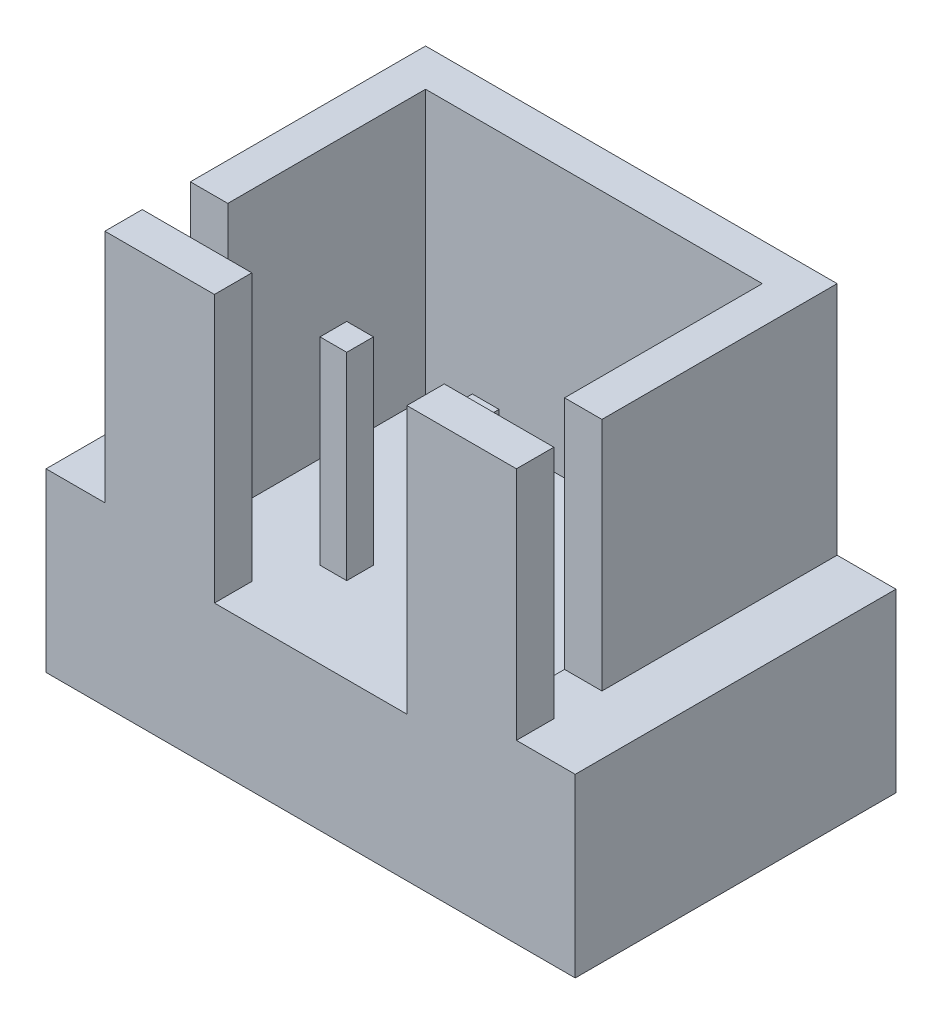
ISO-10303-21;
HEADER;
FILE_DESCRIPTION(('STEP AP214'),'2;1');
FILE_NAME('part.step','',(''),(''),'','','');
FILE_SCHEMA(('AUTOMOTIVE_DESIGN { 1 0 10303 214 1 1 1 1 }'));
ENDSEC;
DATA;
#1=APPLICATION_CONTEXT('core data for automotive mechanical design processes');
#2=APPLICATION_PROTOCOL_DEFINITION('international standard','automotive_design',2000,#1);
#3=PRODUCT_CONTEXT('',#1,'mechanical');
#4=PRODUCT('Part','Part','',(#3));
#5=PRODUCT_RELATED_PRODUCT_CATEGORY('part','',(#4));
#6=PRODUCT_DEFINITION_FORMATION('','',#4);
#7=PRODUCT_DEFINITION_CONTEXT('part definition',#1,'design');
#8=PRODUCT_DEFINITION('design','',#6,#7);
#9=PRODUCT_DEFINITION_SHAPE('','',#8);
#10=(LENGTH_UNIT() NAMED_UNIT(*) SI_UNIT(.MILLI.,.METRE.));
#11=(NAMED_UNIT(*) PLANE_ANGLE_UNIT() SI_UNIT($,.RADIAN.));
#12=(NAMED_UNIT(*) SI_UNIT($,.STERADIAN.) SOLID_ANGLE_UNIT());
#13=UNCERTAINTY_MEASURE_WITH_UNIT(LENGTH_MEASURE(1.E-05),#10,'distance_accuracy_value','');
#14=(GEOMETRIC_REPRESENTATION_CONTEXT(3) GLOBAL_UNCERTAINTY_ASSIGNED_CONTEXT((#13)) GLOBAL_UNIT_ASSIGNED_CONTEXT((#10,
#11,#12)) REPRESENTATION_CONTEXT('',''));
#15=CARTESIAN_POINT('',(0.,0.,0.));
#16=DIRECTION('',(0.,0.,1.));
#17=DIRECTION('',(1.,0.,0.));
#18=AXIS2_PLACEMENT_3D('',#15,#16,#17);
#19=CARTESIAN_POINT('',(0.,2.7,0.));
#20=DIRECTION('',(0.,1.,0.));
#21=DIRECTION('',(0.,0.,1.));
#22=AXIS2_PLACEMENT_3D('',#19,#20,#21);
#23=PLANE('',#22);
#24=DIRECTION('',(0.,0.,1.));
#25=VECTOR('',#24,1.);
#26=CARTESIAN_POINT('',(-3.15,2.7,-2.3));
#27=LINE('',#26,#25);
#28=CARTESIAN_POINT('',(-3.15,2.7,-2.3));
#29=VERTEX_POINT('',#28);
#30=CARTESIAN_POINT('',(-3.15,2.7,2.3));
#31=VERTEX_POINT('',#30);
#32=EDGE_CURVE('E380',#29,#31,#27,.T.);
#33=ORIENTED_EDGE('',*,*,#32,.T.);
#34=DIRECTION('',(1.,0.,0.));
#35=VECTOR('',#34,1.);
#36=CARTESIAN_POINT('',(-3.15,2.7,2.3));
#37=LINE('',#36,#35);
#38=CARTESIAN_POINT('',(-1.8,2.7,2.3));
#39=VERTEX_POINT('',#38);
#40=EDGE_CURVE('E385',#31,#39,#37,.T.);
#41=ORIENTED_EDGE('',*,*,#40,.T.);
#42=DIRECTION('',(0.,0.,-1.));
#43=VECTOR('',#42,1.);
#44=CARTESIAN_POINT('',(-1.8,2.7,2.3));
#45=LINE('',#44,#43);
#46=CARTESIAN_POINT('',(-1.8,2.7,3.));
#47=VERTEX_POINT('',#46);
#48=EDGE_CURVE('E321',#47,#39,#45,.T.);
#49=ORIENTED_EDGE('',*,*,#48,.F.);
#50=DIRECTION('',(-1.,0.,0.));
#51=VECTOR('',#50,1.);
#52=CARTESIAN_POINT('',(-1.8,2.7,3.));
#53=LINE('',#52,#51);
#54=CARTESIAN_POINT('',(1.8,2.7,3.));
#55=VERTEX_POINT('',#54);
#56=EDGE_CURVE('E324',#55,#47,#53,.T.);
#57=ORIENTED_EDGE('',*,*,#56,.F.);
#58=DIRECTION('',(0.,0.,1.));
#59=VECTOR('',#58,1.);
#60=CARTESIAN_POINT('',(1.8,2.7,2.3));
#61=LINE('',#60,#59);
#62=CARTESIAN_POINT('',(1.8,2.7,2.3));
#63=VERTEX_POINT('',#62);
#64=EDGE_CURVE('E319',#63,#55,#61,.T.);
#65=ORIENTED_EDGE('',*,*,#64,.F.);
#66=CARTESIAN_POINT('',(3.15,2.7,2.3));
#67=VERTEX_POINT('',#66);
#68=EDGE_CURVE('E383',#63,#67,#37,.T.);
#69=ORIENTED_EDGE('',*,*,#68,.T.);
#70=DIRECTION('',(0.,0.,-1.));
#71=VECTOR('',#70,1.);
#72=CARTESIAN_POINT('',(3.15,2.7,-2.3));
#73=LINE('',#72,#71);
#74=CARTESIAN_POINT('',(3.15,2.7,-2.3));
#75=VERTEX_POINT('',#74);
#76=EDGE_CURVE('E388',#67,#75,#73,.T.);
#77=ORIENTED_EDGE('',*,*,#76,.T.);
#78=DIRECTION('',(-1.,0.,0.));
#79=VECTOR('',#78,1.);
#80=CARTESIAN_POINT('',(-3.15,2.7,-2.3));
#81=LINE('',#80,#79);
#82=EDGE_CURVE('E391',#75,#29,#81,.T.);
#83=ORIENTED_EDGE('',*,*,#82,.T.);
#84=EDGE_LOOP('',(#33,#41,#49,#57,#65,#69,#77,#83));
#85=FACE_BOUND('',#84,.T.);
#86=DIRECTION('',(1.,0.,0.));
#87=VECTOR('',#86,1.);
#88=CARTESIAN_POINT('',(-1.425,2.7,1.4));
#89=LINE('',#88,#87);
#90=CARTESIAN_POINT('',(-1.425,2.7,1.4));
#91=VERTEX_POINT('',#90);
#92=CARTESIAN_POINT('',(-0.925,2.7,1.4));
#93=VERTEX_POINT('',#92);
#94=EDGE_CURVE('E257',#91,#93,#89,.T.);
#95=ORIENTED_EDGE('',*,*,#94,.F.);
#96=DIRECTION('',(0.,0.,1.));
#97=VECTOR('',#96,1.);
#98=CARTESIAN_POINT('',(-1.425,2.7,0.9));
#99=LINE('',#98,#97);
#100=CARTESIAN_POINT('',(-1.425,2.7,0.9));
#101=VERTEX_POINT('',#100);
#102=EDGE_CURVE('E254',#101,#91,#99,.T.);
#103=ORIENTED_EDGE('',*,*,#102,.F.);
#104=DIRECTION('',(-1.,0.,0.));
#105=VECTOR('',#104,1.);
#106=CARTESIAN_POINT('',(-1.425,2.7,0.9));
#107=LINE('',#106,#105);
#108=CARTESIAN_POINT('',(-0.925,2.7,0.9));
#109=VERTEX_POINT('',#108);
#110=EDGE_CURVE('E266',#109,#101,#107,.T.);
#111=ORIENTED_EDGE('',*,*,#110,.F.);
#112=DIRECTION('',(0.,0.,-1.));
#113=VECTOR('',#112,1.);
#114=CARTESIAN_POINT('',(-0.925,2.7,0.9));
#115=LINE('',#114,#113);
#116=EDGE_CURVE('E274',#93,#109,#115,.T.);
#117=ORIENTED_EDGE('',*,*,#116,.F.);
#118=EDGE_LOOP('',(#95,#103,#111,#117));
#119=FACE_BOUND('',#118,.T.);
#120=DIRECTION('',(0.,0.,1.));
#121=VECTOR('',#120,1.);
#122=CARTESIAN_POINT('',(0.925,2.7,0.9));
#123=LINE('',#122,#121);
#124=CARTESIAN_POINT('',(0.925,2.7,0.9));
#125=VERTEX_POINT('',#124);
#126=CARTESIAN_POINT('',(0.925,2.7,1.4));
#127=VERTEX_POINT('',#126);
#128=EDGE_CURVE('E816',#125,#127,#123,.T.);
#129=ORIENTED_EDGE('',*,*,#128,.F.);
#130=DIRECTION('',(-1.,0.,0.));
#131=VECTOR('',#130,1.);
#132=CARTESIAN_POINT('',(1.425,2.7,0.9));
#133=LINE('',#132,#131);
#134=CARTESIAN_POINT('',(1.425,2.7,0.9));
#135=VERTEX_POINT('',#134);
#136=EDGE_CURVE('E252',#135,#125,#133,.T.);
#137=ORIENTED_EDGE('',*,*,#136,.F.);
#138=DIRECTION('',(0.,0.,-1.));
#139=VECTOR('',#138,1.);
#140=CARTESIAN_POINT('',(1.425,2.7,0.9));
#141=LINE('',#140,#139);
#142=CARTESIAN_POINT('',(1.425,2.7,1.4));
#143=VERTEX_POINT('',#142);
#144=EDGE_CURVE('E248',#143,#135,#141,.T.);
#145=ORIENTED_EDGE('',*,*,#144,.F.);
#146=DIRECTION('',(1.,0.,0.));
#147=VECTOR('',#146,1.);
#148=CARTESIAN_POINT('',(1.425,2.7,1.4));
#149=LINE('',#148,#147);
#150=EDGE_CURVE('E813',#127,#143,#149,.T.);
#151=ORIENTED_EDGE('',*,*,#150,.F.);
#152=EDGE_LOOP('',(#129,#137,#145,#151));
#153=FACE_BOUND('',#152,.T.);
#154=ADVANCED_FACE('F32',(#85,#119,#153),#23,.T.);
#155=CARTESIAN_POINT('',(0.,7.7,0.));
#156=DIRECTION('',(0.,1.,0.));
#157=DIRECTION('',(0.,0.,1.));
#158=AXIS2_PLACEMENT_3D('',#155,#156,#157);
#159=PLANE('',#158);
#160=DIRECTION('',(0.,0.,1.));
#161=VECTOR('',#160,1.);
#162=CARTESIAN_POINT('',(3.85,7.7,-3.));
#163=LINE('',#162,#161);
#164=CARTESIAN_POINT('',(3.85,7.7,2.3));
#165=VERTEX_POINT('',#164);
#166=CARTESIAN_POINT('',(3.85,7.7,3.));
#167=VERTEX_POINT('',#166);
#168=EDGE_CURVE('E339',#165,#167,#163,.T.);
#169=ORIENTED_EDGE('',*,*,#168,.F.);
#170=DIRECTION('',(1.,0.,0.));
#171=VECTOR('',#170,1.);
#172=CARTESIAN_POINT('',(-3.15,7.7,2.3));
#173=LINE('',#172,#171);
#174=CARTESIAN_POINT('',(1.8,7.7,2.3));
#175=VERTEX_POINT('',#174);
#176=EDGE_CURVE('E397',#175,#165,#173,.T.);
#177=ORIENTED_EDGE('',*,*,#176,.F.);
#178=DIRECTION('',(0.,0.,-1.));
#179=VECTOR('',#178,1.);
#180=CARTESIAN_POINT('',(1.8,7.7,2.3));
#181=LINE('',#180,#179);
#182=CARTESIAN_POINT('',(1.8,7.7,3.));
#183=VERTEX_POINT('',#182);
#184=EDGE_CURVE('E326',#183,#175,#181,.T.);
#185=ORIENTED_EDGE('',*,*,#184,.F.);
#186=DIRECTION('',(1.,0.,0.));
#187=VECTOR('',#186,1.);
#188=CARTESIAN_POINT('',(-4.95,7.7,3.));
#189=LINE('',#188,#187);
#190=EDGE_CURVE('E420',#183,#167,#189,.T.);
#191=ORIENTED_EDGE('',*,*,#190,.T.);
#192=EDGE_LOOP('',(#169,#177,#185,#191));
#193=FACE_BOUND('',#192,.T.);
#194=ADVANCED_FACE('F474',(#193),#159,.T.);
#195=CARTESIAN_POINT('',(-3.85,7.7,2.3));
#196=VERTEX_POINT('',#195);
#197=CARTESIAN_POINT('',(-1.8,7.7,2.3));
#198=VERTEX_POINT('',#197);
#199=EDGE_CURVE('E398',#196,#198,#173,.T.);
#200=ORIENTED_EDGE('',*,*,#199,.F.);
#201=DIRECTION('',(0.,0.,-1.));
#202=VECTOR('',#201,1.);
#203=CARTESIAN_POINT('',(-3.85,7.7,-3.));
#204=LINE('',#203,#202);
#205=CARTESIAN_POINT('',(-3.85,7.7,3.));
#206=VERTEX_POINT('',#205);
#207=EDGE_CURVE('E363',#206,#196,#204,.T.);
#208=ORIENTED_EDGE('',*,*,#207,.F.);
#209=CARTESIAN_POINT('',(-1.8,7.7,3.));
#210=VERTEX_POINT('',#209);
#211=EDGE_CURVE('E416',#206,#210,#189,.T.);
#212=ORIENTED_EDGE('',*,*,#211,.T.);
#213=DIRECTION('',(0.,0.,1.));
#214=VECTOR('',#213,1.);
#215=CARTESIAN_POINT('',(-1.8,7.7,2.3));
#216=LINE('',#215,#214);
#217=EDGE_CURVE('E318',#198,#210,#216,.T.);
#218=ORIENTED_EDGE('',*,*,#217,.F.);
#219=EDGE_LOOP('',(#200,#208,#212,#218));
#220=FACE_BOUND('',#219,.T.);
#221=ADVANCED_FACE('F490',(#220),#159,.T.);
#222=CARTESIAN_POINT('',(-3.85,3.3,-3.));
#223=DIRECTION('',(1.,0.,0.));
#224=DIRECTION('',(0.,0.,-1.));
#225=AXIS2_PLACEMENT_3D('',#222,#223,#224);
#226=PLANE('',#225);
#227=ORIENTED_EDGE('',*,*,#207,.T.);
#228=DIRECTION('',(0.,1.,0.));
#229=VECTOR('',#228,1.);
#230=CARTESIAN_POINT('',(-3.85,-4.45241897732572,2.3));
#231=LINE('',#230,#229);
#232=CARTESIAN_POINT('',(-3.85,3.3,2.3));
#233=VERTEX_POINT('',#232);
#234=EDGE_CURVE('E299',#233,#196,#231,.T.);
#235=ORIENTED_EDGE('',*,*,#234,.F.);
#236=DIRECTION('',(0.,0.,-1.));
#237=VECTOR('',#236,1.);
#238=CARTESIAN_POINT('',(-3.85,3.3,-3.));
#239=LINE('',#238,#237);
#240=CARTESIAN_POINT('',(-3.85,3.3,3.));
#241=VERTEX_POINT('',#240);
#242=EDGE_CURVE('E367',#241,#233,#239,.T.);
#243=ORIENTED_EDGE('',*,*,#242,.F.);
#244=DIRECTION('',(0.,1.,0.));
#245=VECTOR('',#244,1.);
#246=CARTESIAN_POINT('',(-3.85,3.3,3.));
#247=LINE('',#246,#245);
#248=EDGE_CURVE('E372',#241,#206,#247,.T.);
#249=ORIENTED_EDGE('',*,*,#248,.T.);
#250=EDGE_LOOP('',(#227,#235,#243,#249));
#251=FACE_BOUND('',#250,.T.);
#252=ADVANCED_FACE('F496',(#251),#226,.F.);
#253=CARTESIAN_POINT('',(3.85,3.3,-3.));
#254=DIRECTION('',(-1.,0.,0.));
#255=DIRECTION('',(0.,0.,1.));
#256=AXIS2_PLACEMENT_3D('',#253,#254,#255);
#257=PLANE('',#256);
#258=DIRECTION('',(0.,0.,1.));
#259=VECTOR('',#258,1.);
#260=CARTESIAN_POINT('',(3.85,3.3,-3.));
#261=LINE('',#260,#259);
#262=CARTESIAN_POINT('',(3.85,3.3,2.3));
#263=VERTEX_POINT('',#262);
#264=CARTESIAN_POINT('',(3.85,3.3,3.));
#265=VERTEX_POINT('',#264);
#266=EDGE_CURVE('E346',#263,#265,#261,.T.);
#267=ORIENTED_EDGE('',*,*,#266,.F.);
#268=DIRECTION('',(0.,1.,0.));
#269=VECTOR('',#268,1.);
#270=CARTESIAN_POINT('',(3.85,-4.45241897732572,2.3));
#271=LINE('',#270,#269);
#272=EDGE_CURVE('E291',#263,#165,#271,.T.);
#273=ORIENTED_EDGE('',*,*,#272,.T.);
#274=ORIENTED_EDGE('',*,*,#168,.T.);
#275=DIRECTION('',(0.,1.,0.));
#276=VECTOR('',#275,1.);
#277=CARTESIAN_POINT('',(3.85,3.3,3.));
#278=LINE('',#277,#276);
#279=EDGE_CURVE('E355',#265,#167,#278,.T.);
#280=ORIENTED_EDGE('',*,*,#279,.F.);
#281=EDGE_LOOP('',(#267,#273,#274,#280));
#282=FACE_BOUND('',#281,.T.);
#283=ADVANCED_FACE('F469',(#282),#257,.F.);
#284=CARTESIAN_POINT('',(-3.15,2.7,2.3));
#285=DIRECTION('',(0.,0.,1.));
#286=DIRECTION('',(1.,0.,0.));
#287=AXIS2_PLACEMENT_3D('',#284,#285,#286);
#288=PLANE('',#287);
#289=DIRECTION('',(0.,1.,0.));
#290=VECTOR('',#289,1.);
#291=CARTESIAN_POINT('',(-3.15,2.7,2.3));
#292=LINE('',#291,#290);
#293=CARTESIAN_POINT('',(-3.15,3.3,2.3));
#294=VERTEX_POINT('',#293);
#295=EDGE_CURVE('E394',#31,#294,#292,.T.);
#296=ORIENTED_EDGE('',*,*,#295,.T.);
#297=DIRECTION('',(1.,0.,0.));
#298=VECTOR('',#297,1.);
#299=CARTESIAN_POINT('',(-3.85,3.3,2.3));
#300=LINE('',#299,#298);
#301=EDGE_CURVE('E289',#233,#294,#300,.T.);
#302=ORIENTED_EDGE('',*,*,#301,.F.);
#303=ORIENTED_EDGE('',*,*,#234,.T.);
#304=ORIENTED_EDGE('',*,*,#199,.T.);
#305=DIRECTION('',(0.,1.,0.));
#306=VECTOR('',#305,1.);
#307=CARTESIAN_POINT('',(-1.8,-0.96742416417845,2.3));
#308=LINE('',#307,#306);
#309=EDGE_CURVE('E322',#39,#198,#308,.T.);
#310=ORIENTED_EDGE('',*,*,#309,.F.);
#311=ORIENTED_EDGE('',*,*,#40,.F.);
#312=EDGE_LOOP('',(#296,#302,#303,#304,#310,#311));
#313=FACE_BOUND('',#312,.T.);
#314=ADVANCED_FACE('F493',(#313),#288,.F.);
#315=CARTESIAN_POINT('',(-4.95,7.7,-3.));
#316=DIRECTION('',(1.,0.,0.));
#317=DIRECTION('',(0.,0.,-1.));
#318=AXIS2_PLACEMENT_3D('',#315,#316,#317);
#319=PLANE('',#318);
#320=DIRECTION('',(0.,0.,1.));
#321=VECTOR('',#320,1.);
#322=CARTESIAN_POINT('',(-4.95,3.3,-3.));
#323=LINE('',#322,#321);
#324=CARTESIAN_POINT('',(-4.95,3.3,-3.));
#325=VERTEX_POINT('',#324);
#326=CARTESIAN_POINT('',(-4.95,3.3,3.));
#327=VERTEX_POINT('',#326);
#328=EDGE_CURVE('E360',#325,#327,#323,.T.);
#329=ORIENTED_EDGE('',*,*,#328,.F.);
#330=DIRECTION('',(0.,-1.,0.));
#331=VECTOR('',#330,1.);
#332=CARTESIAN_POINT('',(-4.95,7.7,-3.));
#333=LINE('',#332,#331);
#334=CARTESIAN_POINT('',(-4.95,0.,-3.));
#335=VERTEX_POINT('',#334);
#336=EDGE_CURVE('E423',#325,#335,#333,.T.);
#337=ORIENTED_EDGE('',*,*,#336,.T.);
#338=DIRECTION('',(0.,0.,1.));
#339=VECTOR('',#338,1.);
#340=CARTESIAN_POINT('',(-4.95,0.,-3.));
#341=LINE('',#340,#339);
#342=CARTESIAN_POINT('',(-4.95,0.,3.));
#343=VERTEX_POINT('',#342);
#344=EDGE_CURVE('E407',#335,#343,#341,.T.);
#345=ORIENTED_EDGE('',*,*,#344,.T.);
#346=DIRECTION('',(0.,-1.,0.));
#347=VECTOR('',#346,1.);
#348=CARTESIAN_POINT('',(-4.95,7.7,3.));
#349=LINE('',#348,#347);
#350=EDGE_CURVE('E11',#327,#343,#349,.T.);
#351=ORIENTED_EDGE('',*,*,#350,.F.);
#352=EDGE_LOOP('',(#329,#337,#345,#351));
#353=FACE_BOUND('',#352,.T.);
#354=ADVANCED_FACE('F34',(#353),#319,.F.);
#355=CARTESIAN_POINT('',(-4.95,7.7,3.));
#356=DIRECTION('',(0.,0.,-1.));
#357=DIRECTION('',(-1.,0.,0.));
#358=AXIS2_PLACEMENT_3D('',#355,#356,#357);
#359=PLANE('',#358);
#360=ORIENTED_EDGE('',*,*,#56,.T.);
#361=DIRECTION('',(0.,1.,0.));
#362=VECTOR('',#361,1.);
#363=CARTESIAN_POINT('',(-1.8,-0.96742416417845,3.));
#364=LINE('',#363,#362);
#365=EDGE_CURVE('E329',#47,#210,#364,.T.);
#366=ORIENTED_EDGE('',*,*,#365,.T.);
#367=ORIENTED_EDGE('',*,*,#211,.F.);
#368=ORIENTED_EDGE('',*,*,#248,.F.);
#369=DIRECTION('',(1.,0.,0.));
#370=VECTOR('',#369,1.);
#371=CARTESIAN_POINT('',(-4.95,3.3,3.));
#372=LINE('',#371,#370);
#373=EDGE_CURVE('E362',#327,#241,#372,.T.);
#374=ORIENTED_EDGE('',*,*,#373,.F.);
#375=ORIENTED_EDGE('',*,*,#350,.T.);
#376=DIRECTION('',(1.,0.,0.));
#377=VECTOR('',#376,1.);
#378=CARTESIAN_POINT('',(-4.95,0.,3.));
#379=LINE('',#378,#377);
#380=CARTESIAN_POINT('',(4.95,0.,3.));
#381=VERTEX_POINT('',#380);
#382=EDGE_CURVE('E426',#343,#381,#379,.T.);
#383=ORIENTED_EDGE('',*,*,#382,.T.);
#384=DIRECTION('',(0.,-1.,0.));
#385=VECTOR('',#384,1.);
#386=CARTESIAN_POINT('',(4.95,7.7,3.));
#387=LINE('',#386,#385);
#388=CARTESIAN_POINT('',(4.95,3.3,3.));
#389=VERTEX_POINT('',#388);
#390=EDGE_CURVE('E40',#389,#381,#387,.T.);
#391=ORIENTED_EDGE('',*,*,#390,.F.);
#392=DIRECTION('',(1.,0.,0.));
#393=VECTOR('',#392,1.);
#394=CARTESIAN_POINT('',(4.95,3.3,3.));
#395=LINE('',#394,#393);
#396=EDGE_CURVE('E350',#265,#389,#395,.T.);
#397=ORIENTED_EDGE('',*,*,#396,.F.);
#398=ORIENTED_EDGE('',*,*,#279,.T.);
#399=ORIENTED_EDGE('',*,*,#190,.F.);
#400=DIRECTION('',(0.,1.,0.));
#401=VECTOR('',#400,1.);
#402=CARTESIAN_POINT('',(1.8,-0.96742416417845,3.));
#403=LINE('',#402,#401);
#404=EDGE_CURVE('E333',#55,#183,#403,.T.);
#405=ORIENTED_EDGE('',*,*,#404,.F.);
#406=EDGE_LOOP('',(#360,#366,#367,#368,#374,#375,#383,#391,#397,#398,#399,#405));
#407=FACE_BOUND('',#406,.T.);
#408=ADVANCED_FACE('F447',(#407),#359,.F.);
#409=CARTESIAN_POINT('',(4.95,7.7,-3.));
#410=DIRECTION('',(-1.,0.,0.));
#411=DIRECTION('',(0.,0.,1.));
#412=AXIS2_PLACEMENT_3D('',#409,#410,#411);
#413=PLANE('',#412);
#414=DIRECTION('',(0.,-1.,0.));
#415=VECTOR('',#414,1.);
#416=CARTESIAN_POINT('',(4.95,7.7,-3.));
#417=LINE('',#416,#415);
#418=CARTESIAN_POINT('',(4.95,3.3,-3.));
#419=VERTEX_POINT('',#418);
#420=CARTESIAN_POINT('',(4.95,0.,-3.));
#421=VERTEX_POINT('',#420);
#422=EDGE_CURVE('E436',#419,#421,#417,.T.);
#423=ORIENTED_EDGE('',*,*,#422,.F.);
#424=DIRECTION('',(0.,0.,-1.));
#425=VECTOR('',#424,1.);
#426=CARTESIAN_POINT('',(4.95,3.3,-3.));
#427=LINE('',#426,#425);
#428=EDGE_CURVE('E340',#389,#419,#427,.T.);
#429=ORIENTED_EDGE('',*,*,#428,.F.);
#430=ORIENTED_EDGE('',*,*,#390,.T.);
#431=DIRECTION('',(0.,0.,-1.));
#432=VECTOR('',#431,1.);
#433=CARTESIAN_POINT('',(4.95,0.,-3.));
#434=LINE('',#433,#432);
#435=EDGE_CURVE('E429',#381,#421,#434,.T.);
#436=ORIENTED_EDGE('',*,*,#435,.T.);
#437=EDGE_LOOP('',(#423,#429,#430,#436));
#438=FACE_BOUND('',#437,.T.);
#439=ADVANCED_FACE('F441',(#438),#413,.F.);
#440=CARTESIAN_POINT('',(-4.95,7.7,-3.));
#441=DIRECTION('',(0.,0.,1.));
#442=DIRECTION('',(1.,0.,0.));
#443=AXIS2_PLACEMENT_3D('',#440,#441,#442);
#444=PLANE('',#443);
#445=DIRECTION('',(-1.,0.,0.));
#446=VECTOR('',#445,1.);
#447=CARTESIAN_POINT('',(-4.95,7.7,-3.));
#448=LINE('',#447,#446);
#449=CARTESIAN_POINT('',(3.85,7.7,-3.));
#450=VERTEX_POINT('',#449);
#451=CARTESIAN_POINT('',(-3.85,7.7,-3.));
#452=VERTEX_POINT('',#451);
#453=EDGE_CURVE('E419',#450,#452,#448,.T.);
#454=ORIENTED_EDGE('',*,*,#453,.F.);
#455=DIRECTION('',(0.,1.,0.));
#456=VECTOR('',#455,1.);
#457=CARTESIAN_POINT('',(3.85,3.3,-3.));
#458=LINE('',#457,#456);
#459=CARTESIAN_POINT('',(3.85,3.3,-3.));
#460=VERTEX_POINT('',#459);
#461=EDGE_CURVE('E352',#460,#450,#458,.T.);
#462=ORIENTED_EDGE('',*,*,#461,.F.);
#463=DIRECTION('',(-1.,0.,0.));
#464=VECTOR('',#463,1.);
#465=CARTESIAN_POINT('',(4.95,3.3,-3.));
#466=LINE('',#465,#464);
#467=EDGE_CURVE('E342',#419,#460,#466,.T.);
#468=ORIENTED_EDGE('',*,*,#467,.F.);
#469=ORIENTED_EDGE('',*,*,#422,.T.);
#470=DIRECTION('',(-1.,0.,0.));
#471=VECTOR('',#470,1.);
#472=CARTESIAN_POINT('',(-4.95,0.,-3.));
#473=LINE('',#472,#471);
#474=EDGE_CURVE('E432',#421,#335,#473,.T.);
#475=ORIENTED_EDGE('',*,*,#474,.T.);
#476=ORIENTED_EDGE('',*,*,#336,.F.);
#477=DIRECTION('',(-1.,0.,0.));
#478=VECTOR('',#477,1.);
#479=CARTESIAN_POINT('',(-4.95,3.3,-3.));
#480=LINE('',#479,#478);
#481=CARTESIAN_POINT('',(-3.85,3.3,-3.));
#482=VERTEX_POINT('',#481);
#483=EDGE_CURVE('E370',#482,#325,#480,.T.);
#484=ORIENTED_EDGE('',*,*,#483,.F.);
#485=DIRECTION('',(0.,1.,0.));
#486=VECTOR('',#485,1.);
#487=CARTESIAN_POINT('',(-3.85,3.3,-3.));
#488=LINE('',#487,#486);
#489=EDGE_CURVE('E375',#482,#452,#488,.T.);
#490=ORIENTED_EDGE('',*,*,#489,.T.);
#491=EDGE_LOOP('',(#454,#462,#468,#469,#475,#476,#484,#490));
#492=FACE_BOUND('',#491,.T.);
#493=ADVANCED_FACE('F456',(#492),#444,.F.);
#494=DIRECTION('',(-1.,0.,0.));
#495=VECTOR('',#494,1.);
#496=CARTESIAN_POINT('',(-3.85,7.7,1.4));
#497=LINE('',#496,#495);
#498=CARTESIAN_POINT('',(3.85,7.7,1.4));
#499=VERTEX_POINT('',#498);
#500=CARTESIAN_POINT('',(3.15,7.7,1.4));
#501=VERTEX_POINT('',#500);
#502=EDGE_CURVE('E286',#499,#501,#497,.T.);
#503=ORIENTED_EDGE('',*,*,#502,.F.);
#504=EDGE_CURVE('E343',#450,#499,#163,.T.);
#505=ORIENTED_EDGE('',*,*,#504,.F.);
#506=ORIENTED_EDGE('',*,*,#453,.T.);
#507=CARTESIAN_POINT('',(-3.85,7.7,1.4));
#508=VERTEX_POINT('',#507);
#509=EDGE_CURVE('E358',#508,#452,#204,.T.);
#510=ORIENTED_EDGE('',*,*,#509,.F.);
#511=CARTESIAN_POINT('',(-3.15,7.7,1.4));
#512=VERTEX_POINT('',#511);
#513=EDGE_CURVE('E285',#512,#508,#497,.T.);
#514=ORIENTED_EDGE('',*,*,#513,.F.);
#515=DIRECTION('',(0.,0.,1.));
#516=VECTOR('',#515,1.);
#517=CARTESIAN_POINT('',(-3.15,7.7,-2.3));
#518=LINE('',#517,#516);
#519=CARTESIAN_POINT('',(-3.15,7.7,-2.3));
#520=VERTEX_POINT('',#519);
#521=EDGE_CURVE('E378',#520,#512,#518,.T.);
#522=ORIENTED_EDGE('',*,*,#521,.F.);
#523=DIRECTION('',(-1.,0.,0.));
#524=VECTOR('',#523,1.);
#525=CARTESIAN_POINT('',(-3.15,7.7,-2.3));
#526=LINE('',#525,#524);
#527=CARTESIAN_POINT('',(3.15,7.7,-2.3));
#528=VERTEX_POINT('',#527);
#529=EDGE_CURVE('E384',#528,#520,#526,.T.);
#530=ORIENTED_EDGE('',*,*,#529,.F.);
#531=DIRECTION('',(0.,0.,-1.));
#532=VECTOR('',#531,1.);
#533=CARTESIAN_POINT('',(3.15,7.7,-2.3));
#534=LINE('',#533,#532);
#535=EDGE_CURVE('E401',#501,#528,#534,.T.);
#536=ORIENTED_EDGE('',*,*,#535,.F.);
#537=EDGE_LOOP('',(#503,#505,#506,#510,#514,#522,#530,#536));
#538=FACE_BOUND('',#537,.T.);
#539=ADVANCED_FACE('F512',(#538),#159,.T.);
#540=CARTESIAN_POINT('',(0.,0.,0.));
#541=DIRECTION('',(0.,1.,0.));
#542=DIRECTION('',(0.,0.,1.));
#543=AXIS2_PLACEMENT_3D('',#540,#541,#542);
#544=PLANE('',#543);
#545=ORIENTED_EDGE('',*,*,#344,.F.);
#546=ORIENTED_EDGE('',*,*,#474,.F.);
#547=ORIENTED_EDGE('',*,*,#435,.F.);
#548=ORIENTED_EDGE('',*,*,#382,.F.);
#549=EDGE_LOOP('',(#545,#546,#547,#548));
#550=FACE_BOUND('',#549,.T.);
#551=ADVANCED_FACE('F452',(#550),#544,.F.);
#552=CARTESIAN_POINT('',(-3.15,2.7,-2.3));
#553=DIRECTION('',(-1.,0.,0.));
#554=DIRECTION('',(0.,0.,1.));
#555=AXIS2_PLACEMENT_3D('',#552,#553,#554);
#556=PLANE('',#555);
#557=DIRECTION('',(0.,-1.,0.));
#558=VECTOR('',#557,1.);
#559=CARTESIAN_POINT('',(-3.15,2.7,1.4));
#560=LINE('',#559,#558);
#561=CARTESIAN_POINT('',(-3.15,3.3,1.4));
#562=VERTEX_POINT('',#561);
#563=EDGE_CURVE('E309',#512,#562,#560,.T.);
#564=ORIENTED_EDGE('',*,*,#563,.T.);
#565=DIRECTION('',(0.,0.,1.));
#566=VECTOR('',#565,1.);
#567=CARTESIAN_POINT('',(-3.15,3.3,-2.3));
#568=LINE('',#567,#566);
#569=EDGE_CURVE('E315',#562,#294,#568,.T.);
#570=ORIENTED_EDGE('',*,*,#569,.T.);
#571=ORIENTED_EDGE('',*,*,#295,.F.);
#572=ORIENTED_EDGE('',*,*,#32,.F.);
#573=DIRECTION('',(0.,1.,0.));
#574=VECTOR('',#573,1.);
#575=CARTESIAN_POINT('',(-3.15,2.7,-2.3));
#576=LINE('',#575,#574);
#577=EDGE_CURVE('E405',#29,#520,#576,.T.);
#578=ORIENTED_EDGE('',*,*,#577,.T.);
#579=ORIENTED_EDGE('',*,*,#521,.T.);
#580=EDGE_LOOP('',(#564,#570,#571,#572,#578,#579));
#581=FACE_BOUND('',#580,.T.);
#582=ADVANCED_FACE('F533',(#581),#556,.F.);
#583=CARTESIAN_POINT('',(-3.15,2.7,-2.3));
#584=DIRECTION('',(0.,0.,-1.));
#585=DIRECTION('',(-1.,0.,0.));
#586=AXIS2_PLACEMENT_3D('',#583,#584,#585);
#587=PLANE('',#586);
#588=ORIENTED_EDGE('',*,*,#529,.T.);
#589=ORIENTED_EDGE('',*,*,#577,.F.);
#590=ORIENTED_EDGE('',*,*,#82,.F.);
#591=DIRECTION('',(0.,1.,0.));
#592=VECTOR('',#591,1.);
#593=CARTESIAN_POINT('',(3.15,2.7,-2.3));
#594=LINE('',#593,#592);
#595=EDGE_CURVE('E408',#75,#528,#594,.T.);
#596=ORIENTED_EDGE('',*,*,#595,.T.);
#597=EDGE_LOOP('',(#588,#589,#590,#596));
#598=FACE_BOUND('',#597,.T.);
#599=ADVANCED_FACE('F528',(#598),#587,.F.);
#600=CARTESIAN_POINT('',(3.15,2.7,-2.3));
#601=DIRECTION('',(1.,0.,0.));
#602=DIRECTION('',(0.,0.,-1.));
#603=AXIS2_PLACEMENT_3D('',#600,#601,#602);
#604=PLANE('',#603);
#605=DIRECTION('',(0.,1.,0.));
#606=VECTOR('',#605,1.);
#607=CARTESIAN_POINT('',(3.15,2.7,2.3));
#608=LINE('',#607,#606);
#609=CARTESIAN_POINT('',(3.15,3.3,2.3));
#610=VERTEX_POINT('',#609);
#611=EDGE_CURVE('E411',#67,#610,#608,.T.);
#612=ORIENTED_EDGE('',*,*,#611,.T.);
#613=DIRECTION('',(0.,0.,-1.));
#614=VECTOR('',#613,1.);
#615=CARTESIAN_POINT('',(3.15,3.3,-2.3));
#616=LINE('',#615,#614);
#617=CARTESIAN_POINT('',(3.15,3.3,1.4));
#618=VERTEX_POINT('',#617);
#619=EDGE_CURVE('E312',#610,#618,#616,.T.);
#620=ORIENTED_EDGE('',*,*,#619,.T.);
#621=DIRECTION('',(0.,1.,0.));
#622=VECTOR('',#621,1.);
#623=CARTESIAN_POINT('',(3.15,2.7,1.4));
#624=LINE('',#623,#622);
#625=EDGE_CURVE('E306',#618,#501,#624,.T.);
#626=ORIENTED_EDGE('',*,*,#625,.T.);
#627=ORIENTED_EDGE('',*,*,#535,.T.);
#628=ORIENTED_EDGE('',*,*,#595,.F.);
#629=ORIENTED_EDGE('',*,*,#76,.F.);
#630=EDGE_LOOP('',(#612,#620,#626,#627,#628,#629));
#631=FACE_BOUND('',#630,.T.);
#632=ADVANCED_FACE('F521',(#631),#604,.F.);
#633=DIRECTION('',(0.,1.,0.));
#634=VECTOR('',#633,1.);
#635=CARTESIAN_POINT('',(1.8,-0.96742416417845,2.3));
#636=LINE('',#635,#634);
#637=EDGE_CURVE('E331',#63,#175,#636,.T.);
#638=ORIENTED_EDGE('',*,*,#637,.T.);
#639=ORIENTED_EDGE('',*,*,#176,.T.);
#640=ORIENTED_EDGE('',*,*,#272,.F.);
#641=EDGE_CURVE('E288',#610,#263,#300,.T.);
#642=ORIENTED_EDGE('',*,*,#641,.F.);
#643=ORIENTED_EDGE('',*,*,#611,.F.);
#644=ORIENTED_EDGE('',*,*,#68,.F.);
#645=EDGE_LOOP('',(#638,#639,#640,#642,#643,#644));
#646=FACE_BOUND('',#645,.T.);
#647=ADVANCED_FACE('F525',(#646),#288,.F.);
#648=CARTESIAN_POINT('',(-3.85,3.3,1.4));
#649=VERTEX_POINT('',#648);
#650=EDGE_CURVE('E366',#649,#482,#239,.T.);
#651=ORIENTED_EDGE('',*,*,#650,.F.);
#652=DIRECTION('',(0.,1.,0.));
#653=VECTOR('',#652,1.);
#654=CARTESIAN_POINT('',(-3.85,-4.45241897732572,1.4));
#655=LINE('',#654,#653);
#656=EDGE_CURVE('E295',#649,#508,#655,.T.);
#657=ORIENTED_EDGE('',*,*,#656,.T.);
#658=ORIENTED_EDGE('',*,*,#509,.T.);
#659=ORIENTED_EDGE('',*,*,#489,.F.);
#660=EDGE_LOOP('',(#651,#657,#658,#659));
#661=FACE_BOUND('',#660,.T.);
#662=ADVANCED_FACE('F506',(#661),#226,.F.);
#663=CARTESIAN_POINT('',(0.,3.3,0.));
#664=DIRECTION('',(0.,1.,0.));
#665=DIRECTION('',(0.,0.,1.));
#666=AXIS2_PLACEMENT_3D('',#663,#664,#665);
#667=PLANE('',#666);
#668=ORIENTED_EDGE('',*,*,#328,.T.);
#669=ORIENTED_EDGE('',*,*,#373,.T.);
#670=ORIENTED_EDGE('',*,*,#242,.T.);
#671=ORIENTED_EDGE('',*,*,#301,.T.);
#672=ORIENTED_EDGE('',*,*,#569,.F.);
#673=DIRECTION('',(-1.,0.,0.));
#674=VECTOR('',#673,1.);
#675=CARTESIAN_POINT('',(-3.85,3.3,1.4));
#676=LINE('',#675,#674);
#677=EDGE_CURVE('E296',#562,#649,#676,.T.);
#678=ORIENTED_EDGE('',*,*,#677,.T.);
#679=ORIENTED_EDGE('',*,*,#650,.T.);
#680=ORIENTED_EDGE('',*,*,#483,.T.);
#681=EDGE_LOOP('',(#668,#669,#670,#671,#672,#678,#679,#680));
#682=FACE_BOUND('',#681,.T.);
#683=ADVANCED_FACE('F501',(#682),#667,.T.);
#684=ORIENTED_EDGE('',*,*,#504,.T.);
#685=DIRECTION('',(0.,1.,0.));
#686=VECTOR('',#685,1.);
#687=CARTESIAN_POINT('',(3.85,-4.45241897732572,1.4));
#688=LINE('',#687,#686);
#689=CARTESIAN_POINT('',(3.85,3.3,1.4));
#690=VERTEX_POINT('',#689);
#691=EDGE_CURVE('E300',#690,#499,#688,.T.);
#692=ORIENTED_EDGE('',*,*,#691,.F.);
#693=EDGE_CURVE('E347',#460,#690,#261,.T.);
#694=ORIENTED_EDGE('',*,*,#693,.F.);
#695=ORIENTED_EDGE('',*,*,#461,.T.);
#696=EDGE_LOOP('',(#684,#692,#694,#695));
#697=FACE_BOUND('',#696,.T.);
#698=ADVANCED_FACE('F516',(#697),#257,.F.);
#699=CARTESIAN_POINT('',(0.,3.3,0.));
#700=DIRECTION('',(0.,-1.,0.));
#701=DIRECTION('',(0.,0.,-1.));
#702=AXIS2_PLACEMENT_3D('',#699,#700,#701);
#703=PLANE('',#702);
#704=ORIENTED_EDGE('',*,*,#428,.T.);
#705=ORIENTED_EDGE('',*,*,#467,.T.);
#706=ORIENTED_EDGE('',*,*,#693,.T.);
#707=EDGE_CURVE('E292',#690,#618,#676,.T.);
#708=ORIENTED_EDGE('',*,*,#707,.T.);
#709=ORIENTED_EDGE('',*,*,#619,.F.);
#710=ORIENTED_EDGE('',*,*,#641,.T.);
#711=ORIENTED_EDGE('',*,*,#266,.T.);
#712=ORIENTED_EDGE('',*,*,#396,.T.);
#713=EDGE_LOOP('',(#704,#705,#706,#708,#709,#710,#711,#712));
#714=FACE_BOUND('',#713,.T.);
#715=ADVANCED_FACE('F461',(#714),#703,.F.);
#716=CARTESIAN_POINT('',(-1.8,-0.96742416417845,2.3));
#717=DIRECTION('',(-1.,0.,0.));
#718=DIRECTION('',(0.,0.,1.));
#719=AXIS2_PLACEMENT_3D('',#716,#717,#718);
#720=PLANE('',#719);
#721=ORIENTED_EDGE('',*,*,#48,.T.);
#722=ORIENTED_EDGE('',*,*,#309,.T.);
#723=ORIENTED_EDGE('',*,*,#217,.T.);
#724=ORIENTED_EDGE('',*,*,#365,.F.);
#725=EDGE_LOOP('',(#721,#722,#723,#724));
#726=FACE_BOUND('',#725,.T.);
#727=ADVANCED_FACE('F487',(#726),#720,.F.);
#728=CARTESIAN_POINT('',(1.8,-0.96742416417845,2.3));
#729=DIRECTION('',(1.,0.,0.));
#730=DIRECTION('',(0.,0.,-1.));
#731=AXIS2_PLACEMENT_3D('',#728,#729,#730);
#732=PLANE('',#731);
#733=ORIENTED_EDGE('',*,*,#64,.T.);
#734=ORIENTED_EDGE('',*,*,#404,.T.);
#735=ORIENTED_EDGE('',*,*,#184,.T.);
#736=ORIENTED_EDGE('',*,*,#637,.F.);
#737=EDGE_LOOP('',(#733,#734,#735,#736));
#738=FACE_BOUND('',#737,.T.);
#739=ADVANCED_FACE('F476',(#738),#732,.F.);
#740=CARTESIAN_POINT('',(-3.85,-4.45241897732572,1.4));
#741=DIRECTION('',(0.,0.,-1.));
#742=DIRECTION('',(-1.,0.,0.));
#743=AXIS2_PLACEMENT_3D('',#740,#741,#742);
#744=PLANE('',#743);
#745=ORIENTED_EDGE('',*,*,#707,.F.);
#746=ORIENTED_EDGE('',*,*,#691,.T.);
#747=ORIENTED_EDGE('',*,*,#502,.T.);
#748=ORIENTED_EDGE('',*,*,#625,.F.);
#749=EDGE_LOOP('',(#745,#746,#747,#748));
#750=FACE_BOUND('',#749,.T.);
#751=ADVANCED_FACE('F518',(#750),#744,.F.);
#752=ORIENTED_EDGE('',*,*,#513,.T.);
#753=ORIENTED_EDGE('',*,*,#656,.F.);
#754=ORIENTED_EDGE('',*,*,#677,.F.);
#755=ORIENTED_EDGE('',*,*,#563,.F.);
#756=EDGE_LOOP('',(#752,#753,#754,#755));
#757=FACE_BOUND('',#756,.T.);
#758=ADVANCED_FACE('F536',(#757),#744,.F.);
#759=CARTESIAN_POINT('',(-1.425,6.4,0.9));
#760=DIRECTION('',(1.,0.,0.));
#761=DIRECTION('',(0.,0.,-1.));
#762=AXIS2_PLACEMENT_3D('',#759,#760,#761);
#763=PLANE('',#762);
#764=ORIENTED_EDGE('',*,*,#102,.T.);
#765=DIRECTION('',(0.,-1.,0.));
#766=VECTOR('',#765,1.);
#767=CARTESIAN_POINT('',(-1.425,6.4,1.4));
#768=LINE('',#767,#766);
#769=CARTESIAN_POINT('',(-1.425,6.4,1.4));
#770=VERTEX_POINT('',#769);
#771=EDGE_CURVE('E283',#770,#91,#768,.T.);
#772=ORIENTED_EDGE('',*,*,#771,.F.);
#773=DIRECTION('',(0.,0.,1.));
#774=VECTOR('',#773,1.);
#775=CARTESIAN_POINT('',(-1.425,6.4,0.9));
#776=LINE('',#775,#774);
#777=CARTESIAN_POINT('',(-1.425,6.4,0.9));
#778=VERTEX_POINT('',#777);
#779=EDGE_CURVE('E262',#778,#770,#776,.T.);
#780=ORIENTED_EDGE('',*,*,#779,.F.);
#781=DIRECTION('',(0.,-1.,0.));
#782=VECTOR('',#781,1.);
#783=CARTESIAN_POINT('',(-1.425,6.4,0.9));
#784=LINE('',#783,#782);
#785=EDGE_CURVE('E271',#778,#101,#784,.T.);
#786=ORIENTED_EDGE('',*,*,#785,.T.);
#787=EDGE_LOOP('',(#764,#772,#780,#786));
#788=FACE_BOUND('',#787,.T.);
#789=ADVANCED_FACE('F538',(#788),#763,.F.);
#790=CARTESIAN_POINT('',(-1.425,6.4,1.4));
#791=DIRECTION('',(0.,0.,-1.));
#792=DIRECTION('',(-1.,0.,0.));
#793=AXIS2_PLACEMENT_3D('',#790,#791,#792);
#794=PLANE('',#793);
#795=ORIENTED_EDGE('',*,*,#94,.T.);
#796=DIRECTION('',(0.,-1.,0.));
#797=VECTOR('',#796,1.);
#798=CARTESIAN_POINT('',(-0.925,6.4,1.4));
#799=LINE('',#798,#797);
#800=CARTESIAN_POINT('',(-0.925,6.4,1.4));
#801=VERTEX_POINT('',#800);
#802=EDGE_CURVE('E280',#801,#93,#799,.T.);
#803=ORIENTED_EDGE('',*,*,#802,.F.);
#804=DIRECTION('',(1.,0.,0.));
#805=VECTOR('',#804,1.);
#806=CARTESIAN_POINT('',(-1.425,6.4,1.4));
#807=LINE('',#806,#805);
#808=EDGE_CURVE('E265',#770,#801,#807,.T.);
#809=ORIENTED_EDGE('',*,*,#808,.F.);
#810=ORIENTED_EDGE('',*,*,#771,.T.);
#811=EDGE_LOOP('',(#795,#803,#809,#810));
#812=FACE_BOUND('',#811,.T.);
#813=ADVANCED_FACE('F544',(#812),#794,.F.);
#814=CARTESIAN_POINT('',(-0.925,6.4,0.9));
#815=DIRECTION('',(-1.,0.,0.));
#816=DIRECTION('',(0.,0.,1.));
#817=AXIS2_PLACEMENT_3D('',#814,#815,#816);
#818=PLANE('',#817);
#819=ORIENTED_EDGE('',*,*,#116,.T.);
#820=DIRECTION('',(0.,-1.,0.));
#821=VECTOR('',#820,1.);
#822=CARTESIAN_POINT('',(-0.925,6.4,0.9));
#823=LINE('',#822,#821);
#824=CARTESIAN_POINT('',(-0.925,6.4,0.9));
#825=VERTEX_POINT('',#824);
#826=EDGE_CURVE('E55',#825,#109,#823,.T.);
#827=ORIENTED_EDGE('',*,*,#826,.F.);
#828=DIRECTION('',(0.,0.,-1.));
#829=VECTOR('',#828,1.);
#830=CARTESIAN_POINT('',(-0.925,6.4,0.9));
#831=LINE('',#830,#829);
#832=EDGE_CURVE('E268',#801,#825,#831,.T.);
#833=ORIENTED_EDGE('',*,*,#832,.F.);
#834=ORIENTED_EDGE('',*,*,#802,.T.);
#835=EDGE_LOOP('',(#819,#827,#833,#834));
#836=FACE_BOUND('',#835,.T.);
#837=ADVANCED_FACE('F733',(#836),#818,.F.);
#838=CARTESIAN_POINT('',(-1.425,6.4,0.9));
#839=DIRECTION('',(0.,0.,1.));
#840=DIRECTION('',(1.,0.,0.));
#841=AXIS2_PLACEMENT_3D('',#838,#839,#840);
#842=PLANE('',#841);
#843=ORIENTED_EDGE('',*,*,#110,.T.);
#844=ORIENTED_EDGE('',*,*,#785,.F.);
#845=DIRECTION('',(-1.,0.,0.));
#846=VECTOR('',#845,1.);
#847=CARTESIAN_POINT('',(-1.425,6.4,0.9));
#848=LINE('',#847,#846);
#849=EDGE_CURVE('E270',#825,#778,#848,.T.);
#850=ORIENTED_EDGE('',*,*,#849,.F.);
#851=ORIENTED_EDGE('',*,*,#826,.T.);
#852=EDGE_LOOP('',(#843,#844,#850,#851));
#853=FACE_BOUND('',#852,.T.);
#854=ADVANCED_FACE('F743',(#853),#842,.F.);
#855=CARTESIAN_POINT('',(0.,6.4,0.));
#856=DIRECTION('',(0.,1.,0.));
#857=DIRECTION('',(0.,0.,1.));
#858=AXIS2_PLACEMENT_3D('',#855,#856,#857);
#859=PLANE('',#858);
#860=ORIENTED_EDGE('',*,*,#779,.T.);
#861=ORIENTED_EDGE('',*,*,#808,.T.);
#862=ORIENTED_EDGE('',*,*,#832,.T.);
#863=ORIENTED_EDGE('',*,*,#849,.T.);
#864=EDGE_LOOP('',(#860,#861,#862,#863));
#865=FACE_BOUND('',#864,.T.);
#866=ADVANCED_FACE('F753',(#865),#859,.T.);
#867=CARTESIAN_POINT('',(1.425,6.4,0.9));
#868=DIRECTION('',(0.,0.,1.));
#869=DIRECTION('',(1.,0.,0.));
#870=AXIS2_PLACEMENT_3D('',#867,#868,#869);
#871=PLANE('',#870);
#872=ORIENTED_EDGE('',*,*,#136,.T.);
#873=DIRECTION('',(0.,-1.,0.));
#874=VECTOR('',#873,1.);
#875=CARTESIAN_POINT('',(0.925,6.4,0.9));
#876=LINE('',#875,#874);
#877=CARTESIAN_POINT('',(0.925,6.4,0.9));
#878=VERTEX_POINT('',#877);
#879=EDGE_CURVE('E233',#878,#125,#876,.T.);
#880=ORIENTED_EDGE('',*,*,#879,.F.);
#881=DIRECTION('',(-1.,0.,0.));
#882=VECTOR('',#881,1.);
#883=CARTESIAN_POINT('',(1.425,6.4,0.9));
#884=LINE('',#883,#882);
#885=CARTESIAN_POINT('',(1.425,6.4,0.9));
#886=VERTEX_POINT('',#885);
#887=EDGE_CURVE('E240',#886,#878,#884,.T.);
#888=ORIENTED_EDGE('',*,*,#887,.F.);
#889=DIRECTION('',(0.,-1.,0.));
#890=VECTOR('',#889,1.);
#891=CARTESIAN_POINT('',(1.425,6.4,0.9));
#892=LINE('',#891,#890);
#893=EDGE_CURVE('E810',#886,#135,#892,.T.);
#894=ORIENTED_EDGE('',*,*,#893,.T.);
#895=EDGE_LOOP('',(#872,#880,#888,#894));
#896=FACE_BOUND('',#895,.T.);
#897=ADVANCED_FACE('F250',(#896),#871,.F.);
#898=CARTESIAN_POINT('',(0.925,6.4,0.9));
#899=DIRECTION('',(1.,0.,0.));
#900=DIRECTION('',(0.,0.,-1.));
#901=AXIS2_PLACEMENT_3D('',#898,#899,#900);
#902=PLANE('',#901);
#903=ORIENTED_EDGE('',*,*,#128,.T.);
#904=DIRECTION('',(0.,-1.,0.));
#905=VECTOR('',#904,1.);
#906=CARTESIAN_POINT('',(0.925,6.4,1.4));
#907=LINE('',#906,#905);
#908=CARTESIAN_POINT('',(0.925,6.4,1.4));
#909=VERTEX_POINT('',#908);
#910=EDGE_CURVE('E236',#909,#127,#907,.T.);
#911=ORIENTED_EDGE('',*,*,#910,.F.);
#912=DIRECTION('',(0.,0.,1.));
#913=VECTOR('',#912,1.);
#914=CARTESIAN_POINT('',(0.925,6.4,0.9));
#915=LINE('',#914,#913);
#916=EDGE_CURVE('E229',#878,#909,#915,.T.);
#917=ORIENTED_EDGE('',*,*,#916,.F.);
#918=ORIENTED_EDGE('',*,*,#879,.T.);
#919=EDGE_LOOP('',(#903,#911,#917,#918));
#920=FACE_BOUND('',#919,.T.);
#921=ADVANCED_FACE('F231',(#920),#902,.F.);
#922=CARTESIAN_POINT('',(1.425,6.4,1.4));
#923=DIRECTION('',(0.,0.,-1.));
#924=DIRECTION('',(-1.,0.,0.));
#925=AXIS2_PLACEMENT_3D('',#922,#923,#924);
#926=PLANE('',#925);
#927=ORIENTED_EDGE('',*,*,#150,.T.);
#928=DIRECTION('',(0.,-1.,0.));
#929=VECTOR('',#928,1.);
#930=CARTESIAN_POINT('',(1.425,6.4,1.4));
#931=LINE('',#930,#929);
#932=CARTESIAN_POINT('',(1.425,6.4,1.4));
#933=VERTEX_POINT('',#932);
#934=EDGE_CURVE('E47',#933,#143,#931,.T.);
#935=ORIENTED_EDGE('',*,*,#934,.F.);
#936=DIRECTION('',(1.,0.,0.));
#937=VECTOR('',#936,1.);
#938=CARTESIAN_POINT('',(1.425,6.4,1.4));
#939=LINE('',#938,#937);
#940=EDGE_CURVE('E239',#909,#933,#939,.T.);
#941=ORIENTED_EDGE('',*,*,#940,.F.);
#942=ORIENTED_EDGE('',*,*,#910,.T.);
#943=EDGE_LOOP('',(#927,#935,#941,#942));
#944=FACE_BOUND('',#943,.T.);
#945=ADVANCED_FACE('F779',(#944),#926,.F.);
#946=CARTESIAN_POINT('',(1.425,6.4,0.9));
#947=DIRECTION('',(-1.,0.,0.));
#948=DIRECTION('',(0.,0.,1.));
#949=AXIS2_PLACEMENT_3D('',#946,#947,#948);
#950=PLANE('',#949);
#951=ORIENTED_EDGE('',*,*,#144,.T.);
#952=ORIENTED_EDGE('',*,*,#893,.F.);
#953=DIRECTION('',(0.,0.,-1.));
#954=VECTOR('',#953,1.);
#955=CARTESIAN_POINT('',(1.425,6.4,0.9));
#956=LINE('',#955,#954);
#957=EDGE_CURVE('E244',#933,#886,#956,.T.);
#958=ORIENTED_EDGE('',*,*,#957,.F.);
#959=ORIENTED_EDGE('',*,*,#934,.T.);
#960=EDGE_LOOP('',(#951,#952,#958,#959));
#961=FACE_BOUND('',#960,.T.);
#962=ADVANCED_FACE('F788',(#961),#950,.F.);
#963=CARTESIAN_POINT('',(0.,6.4,0.));
#964=DIRECTION('',(0.,1.,0.));
#965=DIRECTION('',(0.,0.,1.));
#966=AXIS2_PLACEMENT_3D('',#963,#964,#965);
#967=PLANE('',#966);
#968=ORIENTED_EDGE('',*,*,#887,.T.);
#969=ORIENTED_EDGE('',*,*,#916,.T.);
#970=ORIENTED_EDGE('',*,*,#940,.T.);
#971=ORIENTED_EDGE('',*,*,#957,.T.);
#972=EDGE_LOOP('',(#968,#969,#970,#971));
#973=FACE_BOUND('',#972,.T.);
#974=ADVANCED_FACE('F243',(#973),#967,.T.);
#975=CLOSED_SHELL('',(#154,#194,#221,#252,#283,#314,#354,#408,#439,#493,#539,#551,#582,#599,
#632,#647,#662,#683,#698,#715,#727,#739,#751,#758,#789,#813,#837,#854,#866,#897,#921,#945,#962,#974));
#976=MANIFOLD_SOLID_BREP('B2',#975);
#977=ADVANCED_BREP_SHAPE_REPRESENTATION('',(#18,#976),#14);
#978=SHAPE_DEFINITION_REPRESENTATION(#9,#977);
ENDSEC;
END-ISO-10303-21;
